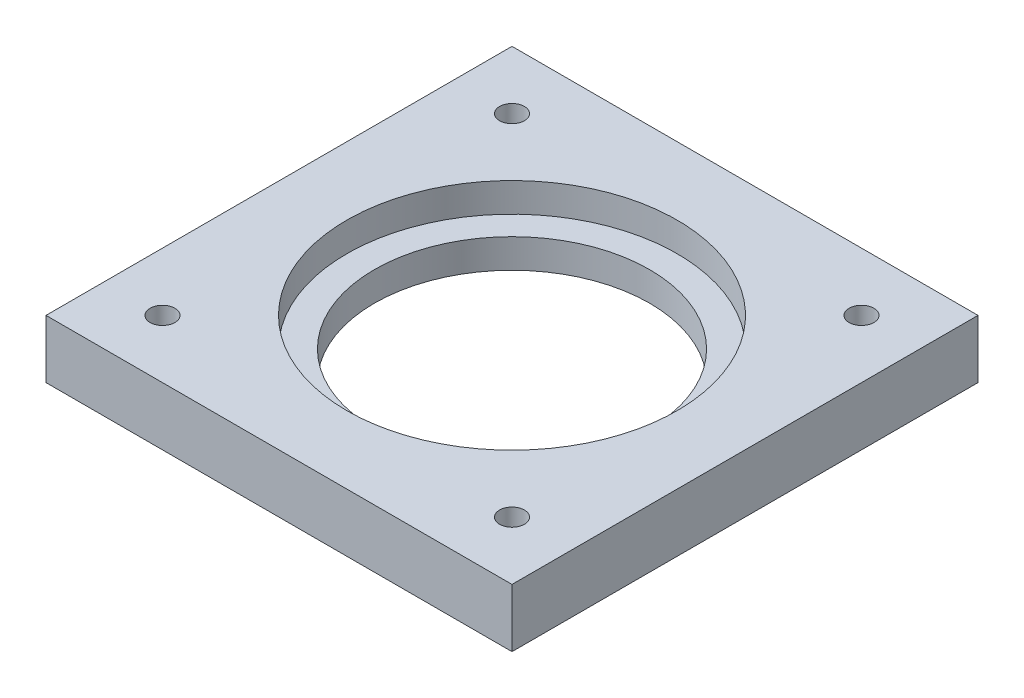
ISO-10303-21;
HEADER;
FILE_DESCRIPTION(('STEP AP214'),'2;1');
FILE_NAME('part.step','',(''),(''),'','','');
FILE_SCHEMA(('AUTOMOTIVE_DESIGN { 1 0 10303 214 1 1 1 1 }'));
ENDSEC;
DATA;
#1=APPLICATION_CONTEXT('core data for automotive mechanical design processes');
#2=APPLICATION_PROTOCOL_DEFINITION('international standard','automotive_design',2000,#1);
#3=PRODUCT_CONTEXT('',#1,'mechanical');
#4=PRODUCT('Part','Part','',(#3));
#5=PRODUCT_RELATED_PRODUCT_CATEGORY('part','',(#4));
#6=PRODUCT_DEFINITION_FORMATION('','',#4);
#7=PRODUCT_DEFINITION_CONTEXT('part definition',#1,'design');
#8=PRODUCT_DEFINITION('design','',#6,#7);
#9=PRODUCT_DEFINITION_SHAPE('','',#8);
#10=(LENGTH_UNIT() NAMED_UNIT(*) SI_UNIT(.MILLI.,.METRE.));
#11=(NAMED_UNIT(*) PLANE_ANGLE_UNIT() SI_UNIT($,.RADIAN.));
#12=(NAMED_UNIT(*) SI_UNIT($,.STERADIAN.) SOLID_ANGLE_UNIT());
#13=UNCERTAINTY_MEASURE_WITH_UNIT(LENGTH_MEASURE(1.E-05),#10,'distance_accuracy_value','');
#14=(GEOMETRIC_REPRESENTATION_CONTEXT(3) GLOBAL_UNCERTAINTY_ASSIGNED_CONTEXT((#13)) GLOBAL_UNIT_ASSIGNED_CONTEXT((#10,
#11,#12)) REPRESENTATION_CONTEXT('',''));
#15=CARTESIAN_POINT('',(0.,0.,0.));
#16=DIRECTION('',(0.,0.,1.));
#17=DIRECTION('',(1.,0.,0.));
#18=AXIS2_PLACEMENT_3D('',#15,#16,#17);
#19=CARTESIAN_POINT('',(0.,6.35,0.));
#20=DIRECTION('',(-1.,0.,0.));
#21=DIRECTION('',(0.,0.,1.));
#22=AXIS2_PLACEMENT_3D('',#19,#20,#21);
#23=PLANE('',#22);
#24=DIRECTION('',(0.,0.,-1.));
#25=VECTOR('',#24,1.);
#26=CARTESIAN_POINT('',(0.,0.,0.));
#27=LINE('',#26,#25);
#28=CARTESIAN_POINT('',(0.,0.,0.));
#29=VERTEX_POINT('',#28);
#30=CARTESIAN_POINT('',(0.,0.,-50.8));
#31=VERTEX_POINT('',#30);
#32=EDGE_CURVE('E130',#29,#31,#27,.T.);
#33=ORIENTED_EDGE('',*,*,#32,.T.);
#34=DIRECTION('',(0.,-1.,0.));
#35=VECTOR('',#34,1.);
#36=CARTESIAN_POINT('',(0.,6.35,-50.8));
#37=LINE('',#36,#35);
#38=CARTESIAN_POINT('',(0.,6.35,-50.8));
#39=VERTEX_POINT('',#38);
#40=EDGE_CURVE('E12',#39,#31,#37,.T.);
#41=ORIENTED_EDGE('',*,*,#40,.F.);
#42=DIRECTION('',(0.,0.,-1.));
#43=VECTOR('',#42,1.);
#44=CARTESIAN_POINT('',(0.,6.35,0.));
#45=LINE('',#44,#43);
#46=CARTESIAN_POINT('',(0.,6.35,0.));
#47=VERTEX_POINT('',#46);
#48=EDGE_CURVE('E93',#47,#39,#45,.T.);
#49=ORIENTED_EDGE('',*,*,#48,.F.);
#50=DIRECTION('',(0.,-1.,0.));
#51=VECTOR('',#50,1.);
#52=CARTESIAN_POINT('',(0.,6.35,0.));
#53=LINE('',#52,#51);
#54=EDGE_CURVE('E105',#47,#29,#53,.T.);
#55=ORIENTED_EDGE('',*,*,#54,.T.);
#56=EDGE_LOOP('',(#33,#41,#49,#55));
#57=FACE_BOUND('',#56,.T.);
#58=ADVANCED_FACE('F40',(#57),#23,.F.);
#59=CARTESIAN_POINT('',(0.,6.35,-50.8));
#60=DIRECTION('',(0.,0.,1.));
#61=DIRECTION('',(1.,0.,0.));
#62=AXIS2_PLACEMENT_3D('',#59,#60,#61);
#63=PLANE('',#62);
#64=DIRECTION('',(-1.,0.,0.));
#65=VECTOR('',#64,1.);
#66=CARTESIAN_POINT('',(0.,0.,-50.8));
#67=LINE('',#66,#65);
#68=CARTESIAN_POINT('',(-50.8,0.,-50.8));
#69=VERTEX_POINT('',#68);
#70=EDGE_CURVE('E98',#31,#69,#67,.T.);
#71=ORIENTED_EDGE('',*,*,#70,.T.);
#72=DIRECTION('',(0.,-1.,0.));
#73=VECTOR('',#72,1.);
#74=CARTESIAN_POINT('',(-50.8,6.35,-50.8));
#75=LINE('',#74,#73);
#76=CARTESIAN_POINT('',(-50.8,6.35,-50.8));
#77=VERTEX_POINT('',#76);
#78=EDGE_CURVE('E50',#77,#69,#75,.T.);
#79=ORIENTED_EDGE('',*,*,#78,.F.);
#80=DIRECTION('',(-1.,0.,0.));
#81=VECTOR('',#80,1.);
#82=CARTESIAN_POINT('',(0.,6.35,-50.8));
#83=LINE('',#82,#81);
#84=EDGE_CURVE('E88',#39,#77,#83,.T.);
#85=ORIENTED_EDGE('',*,*,#84,.F.);
#86=ORIENTED_EDGE('',*,*,#40,.T.);
#87=EDGE_LOOP('',(#71,#79,#85,#86));
#88=FACE_BOUND('',#87,.T.);
#89=ADVANCED_FACE('F97',(#88),#63,.F.);
#90=CARTESIAN_POINT('',(-50.8,6.35,0.));
#91=DIRECTION('',(1.,0.,0.));
#92=DIRECTION('',(0.,0.,-1.));
#93=AXIS2_PLACEMENT_3D('',#90,#91,#92);
#94=PLANE('',#93);
#95=DIRECTION('',(0.,0.,1.));
#96=VECTOR('',#95,1.);
#97=CARTESIAN_POINT('',(-50.8,0.,0.));
#98=LINE('',#97,#96);
#99=CARTESIAN_POINT('',(-50.8,0.,0.));
#100=VERTEX_POINT('',#99);
#101=EDGE_CURVE('E75',#69,#100,#98,.T.);
#102=ORIENTED_EDGE('',*,*,#101,.T.);
#103=DIRECTION('',(0.,-1.,0.));
#104=VECTOR('',#103,1.);
#105=CARTESIAN_POINT('',(-50.8,6.35,0.));
#106=LINE('',#105,#104);
#107=CARTESIAN_POINT('',(-50.8,6.35,0.));
#108=VERTEX_POINT('',#107);
#109=EDGE_CURVE('E99',#108,#100,#106,.T.);
#110=ORIENTED_EDGE('',*,*,#109,.F.);
#111=DIRECTION('',(0.,0.,1.));
#112=VECTOR('',#111,1.);
#113=CARTESIAN_POINT('',(-50.8,6.35,0.));
#114=LINE('',#113,#112);
#115=EDGE_CURVE('E91',#77,#108,#114,.T.);
#116=ORIENTED_EDGE('',*,*,#115,.F.);
#117=ORIENTED_EDGE('',*,*,#78,.T.);
#118=EDGE_LOOP('',(#102,#110,#116,#117));
#119=FACE_BOUND('',#118,.T.);
#120=ADVANCED_FACE('F101',(#119),#94,.F.);
#121=CARTESIAN_POINT('',(0.,6.35,0.));
#122=DIRECTION('',(0.,0.,-1.));
#123=DIRECTION('',(-1.,0.,0.));
#124=AXIS2_PLACEMENT_3D('',#121,#122,#123);
#125=PLANE('',#124);
#126=DIRECTION('',(1.,0.,0.));
#127=VECTOR('',#126,1.);
#128=CARTESIAN_POINT('',(0.,0.,0.));
#129=LINE('',#128,#127);
#130=EDGE_CURVE('E81',#100,#29,#129,.T.);
#131=ORIENTED_EDGE('',*,*,#130,.T.);
#132=ORIENTED_EDGE('',*,*,#54,.F.);
#133=DIRECTION('',(1.,0.,0.));
#134=VECTOR('',#133,1.);
#135=CARTESIAN_POINT('',(0.,6.35,0.));
#136=LINE('',#135,#134);
#137=EDGE_CURVE('E58',#108,#47,#136,.T.);
#138=ORIENTED_EDGE('',*,*,#137,.F.);
#139=ORIENTED_EDGE('',*,*,#109,.T.);
#140=EDGE_LOOP('',(#131,#132,#138,#139));
#141=FACE_BOUND('',#140,.T.);
#142=ADVANCED_FACE('F193',(#141),#125,.F.);
#143=CARTESIAN_POINT('',(0.,6.35,0.));
#144=DIRECTION('',(0.,1.,0.));
#145=DIRECTION('',(0.,0.,1.));
#146=AXIS2_PLACEMENT_3D('',#143,#144,#145);
#147=PLANE('',#146);
#148=CARTESIAN_POINT('',(-6.35,6.35,-6.34999999999999));
#149=DIRECTION('',(0.,-1.,0.));
#150=DIRECTION('',(0.,0.,-1.));
#151=AXIS2_PLACEMENT_3D('',#148,#149,#150);
#152=CIRCLE('',#151,1.35255);
#153=CARTESIAN_POINT('',(-6.35,6.35,-7.70254999999999));
#154=VERTEX_POINT('',#153);
#155=EDGE_CURVE('E160',#154,#154,#152,.T.);
#156=ORIENTED_EDGE('',*,*,#155,.T.);
#157=EDGE_LOOP('',(#156));
#158=FACE_BOUND('',#157,.T.);
#159=CARTESIAN_POINT('',(-6.35000000000008,6.35,-44.4500000000005));
#160=DIRECTION('',(0.,-1.,0.));
#161=DIRECTION('',(0.,0.,-1.));
#162=AXIS2_PLACEMENT_3D('',#159,#160,#161);
#163=CIRCLE('',#162,1.35255);
#164=CARTESIAN_POINT('',(-6.35000000000008,6.35,-45.8025500000005));
#165=VERTEX_POINT('',#164);
#166=EDGE_CURVE('E152',#165,#165,#163,.T.);
#167=ORIENTED_EDGE('',*,*,#166,.T.);
#168=EDGE_LOOP('',(#167));
#169=FACE_BOUND('',#168,.T.);
#170=CARTESIAN_POINT('',(-44.4500000000006,6.35,-44.4500000000003));
#171=DIRECTION('',(0.,-1.,0.));
#172=DIRECTION('',(0.,0.,-1.));
#173=AXIS2_PLACEMENT_3D('',#170,#171,#172);
#174=CIRCLE('',#173,1.35255);
#175=CARTESIAN_POINT('',(-44.4500000000006,6.35,-45.8025500000003));
#176=VERTEX_POINT('',#175);
#177=EDGE_CURVE('E145',#176,#176,#174,.T.);
#178=ORIENTED_EDGE('',*,*,#177,.T.);
#179=EDGE_LOOP('',(#178));
#180=FACE_BOUND('',#179,.T.);
#181=CARTESIAN_POINT('',(-44.4500000000002,6.35,-6.34999999999978));
#182=DIRECTION('',(0.,-1.,0.));
#183=DIRECTION('',(0.,0.,-1.));
#184=AXIS2_PLACEMENT_3D('',#181,#182,#183);
#185=CIRCLE('',#184,1.35255);
#186=CARTESIAN_POINT('',(-44.4500000000002,6.35,-7.70254999999978));
#187=VERTEX_POINT('',#186);
#188=EDGE_CURVE('E134',#187,#187,#185,.T.);
#189=ORIENTED_EDGE('',*,*,#188,.T.);
#190=EDGE_LOOP('',(#189));
#191=FACE_BOUND('',#190,.T.);
#192=CARTESIAN_POINT('',(-25.4,6.35,-25.4));
#193=DIRECTION('',(0.,1.,0.));
#194=DIRECTION('',(0.,0.,1.));
#195=AXIS2_PLACEMENT_3D('',#192,#193,#194);
#196=CIRCLE('',#195,18.);
#197=CARTESIAN_POINT('',(-25.4,6.35,-7.4));
#198=VERTEX_POINT('',#197);
#199=EDGE_CURVE('E121',#198,#198,#196,.T.);
#200=ORIENTED_EDGE('',*,*,#199,.F.);
#201=EDGE_LOOP('',(#200));
#202=FACE_BOUND('',#201,.T.);
#203=ORIENTED_EDGE('',*,*,#48,.T.);
#204=ORIENTED_EDGE('',*,*,#84,.T.);
#205=ORIENTED_EDGE('',*,*,#115,.T.);
#206=ORIENTED_EDGE('',*,*,#137,.T.);
#207=EDGE_LOOP('',(#203,#204,#205,#206));
#208=FACE_BOUND('',#207,.T.);
#209=ADVANCED_FACE('F89',(#158,#169,#180,#191,#202,#208),#147,.T.);
#210=CARTESIAN_POINT('',(0.,0.,0.));
#211=DIRECTION('',(0.,1.,0.));
#212=DIRECTION('',(0.,0.,1.));
#213=AXIS2_PLACEMENT_3D('',#210,#211,#212);
#214=PLANE('',#213);
#215=CARTESIAN_POINT('',(-6.35,0.,-6.34999999999999));
#216=DIRECTION('',(0.,-1.,0.));
#217=DIRECTION('',(0.,0.,-1.));
#218=AXIS2_PLACEMENT_3D('',#215,#216,#217);
#219=CIRCLE('',#218,1.35255);
#220=CARTESIAN_POINT('',(-6.35,0.,-7.70254999999999));
#221=VERTEX_POINT('',#220);
#222=EDGE_CURVE('E165',#221,#221,#219,.T.);
#223=ORIENTED_EDGE('',*,*,#222,.F.);
#224=EDGE_LOOP('',(#223));
#225=FACE_BOUND('',#224,.T.);
#226=CARTESIAN_POINT('',(-6.35000000000008,0.,-44.4500000000005));
#227=DIRECTION('',(0.,-1.,0.));
#228=DIRECTION('',(0.,0.,-1.));
#229=AXIS2_PLACEMENT_3D('',#226,#227,#228);
#230=CIRCLE('',#229,1.35255);
#231=CARTESIAN_POINT('',(-6.35000000000008,0.,-45.8025500000005));
#232=VERTEX_POINT('',#231);
#233=EDGE_CURVE('E157',#232,#232,#230,.T.);
#234=ORIENTED_EDGE('',*,*,#233,.F.);
#235=EDGE_LOOP('',(#234));
#236=FACE_BOUND('',#235,.T.);
#237=CARTESIAN_POINT('',(-44.4500000000006,0.,-44.4500000000003));
#238=DIRECTION('',(0.,-1.,0.));
#239=DIRECTION('',(0.,0.,-1.));
#240=AXIS2_PLACEMENT_3D('',#237,#238,#239);
#241=CIRCLE('',#240,1.35255);
#242=CARTESIAN_POINT('',(-44.4500000000006,0.,-45.8025500000003));
#243=VERTEX_POINT('',#242);
#244=EDGE_CURVE('E150',#243,#243,#241,.T.);
#245=ORIENTED_EDGE('',*,*,#244,.F.);
#246=EDGE_LOOP('',(#245));
#247=FACE_BOUND('',#246,.T.);
#248=CARTESIAN_POINT('',(-44.4500000000002,0.,-6.34999999999978));
#249=DIRECTION('',(0.,-1.,0.));
#250=DIRECTION('',(0.,0.,-1.));
#251=AXIS2_PLACEMENT_3D('',#248,#249,#250);
#252=CIRCLE('',#251,1.35255);
#253=CARTESIAN_POINT('',(-44.4500000000002,0.,-7.70254999999978));
#254=VERTEX_POINT('',#253);
#255=EDGE_CURVE('E139',#254,#254,#252,.T.);
#256=ORIENTED_EDGE('',*,*,#255,.F.);
#257=EDGE_LOOP('',(#256));
#258=FACE_BOUND('',#257,.T.);
#259=CARTESIAN_POINT('',(-25.4000000000002,0.,-25.4000000000002));
#260=DIRECTION('',(0.,-1.,0.));
#261=DIRECTION('',(0.,0.,-1.));
#262=AXIS2_PLACEMENT_3D('',#259,#260,#261);
#263=CIRCLE('',#262,15.);
#264=CARTESIAN_POINT('',(-25.4000000000002,0.,-40.4000000000002));
#265=VERTEX_POINT('',#264);
#266=EDGE_CURVE('E131',#265,#265,#263,.T.);
#267=ORIENTED_EDGE('',*,*,#266,.F.);
#268=EDGE_LOOP('',(#267));
#269=FACE_BOUND('',#268,.T.);
#270=ORIENTED_EDGE('',*,*,#32,.F.);
#271=ORIENTED_EDGE('',*,*,#130,.F.);
#272=ORIENTED_EDGE('',*,*,#101,.F.);
#273=ORIENTED_EDGE('',*,*,#70,.F.);
#274=EDGE_LOOP('',(#270,#271,#272,#273));
#275=FACE_BOUND('',#274,.T.);
#276=ADVANCED_FACE('F171',(#225,#236,#247,#258,#269,#275),#214,.F.);
#277=CARTESIAN_POINT('',(-25.4,3.175,-25.4));
#278=DIRECTION('',(0.,1.,0.));
#279=DIRECTION('',(0.,0.,1.));
#280=AXIS2_PLACEMENT_3D('',#277,#278,#279);
#281=CYLINDRICAL_SURFACE('',#280,18.);
#282=CARTESIAN_POINT('',(-25.4,3.175,-25.4));
#283=DIRECTION('',(0.,1.,0.));
#284=DIRECTION('',(0.,0.,1.));
#285=AXIS2_PLACEMENT_3D('',#282,#283,#284);
#286=CIRCLE('',#285,18.);
#287=CARTESIAN_POINT('',(-25.4,3.175,-7.4));
#288=VERTEX_POINT('',#287);
#289=EDGE_CURVE('E125',#288,#288,#286,.T.);
#290=ORIENTED_EDGE('',*,*,#289,.F.);
#291=EDGE_LOOP('',(#290));
#292=FACE_BOUND('',#291,.T.);
#293=ORIENTED_EDGE('',*,*,#199,.T.);
#294=EDGE_LOOP('',(#293));
#295=FACE_BOUND('',#294,.T.);
#296=ADVANCED_FACE('F174',(#292,#295),#281,.F.);
#297=CARTESIAN_POINT('',(-25.4,3.175,-25.4));
#298=DIRECTION('',(0.,1.,0.));
#299=DIRECTION('',(0.,0.,1.));
#300=AXIS2_PLACEMENT_3D('',#297,#298,#299);
#301=PLANE('',#300);
#302=CARTESIAN_POINT('',(-25.4000000000002,3.175,-25.4000000000002));
#303=DIRECTION('',(0.,1.,0.));
#304=DIRECTION('',(0.,0.,1.));
#305=AXIS2_PLACEMENT_3D('',#302,#303,#304);
#306=CIRCLE('',#305,15.);
#307=CARTESIAN_POINT('',(-25.4000000000002,3.175,-10.4000000000002));
#308=VERTEX_POINT('',#307);
#309=EDGE_CURVE('E43',#308,#308,#306,.T.);
#310=ORIENTED_EDGE('',*,*,#309,.F.);
#311=EDGE_LOOP('',(#310));
#312=FACE_BOUND('',#311,.T.);
#313=ORIENTED_EDGE('',*,*,#289,.T.);
#314=EDGE_LOOP('',(#313));
#315=FACE_BOUND('',#314,.T.);
#316=ADVANCED_FACE('F210',(#312,#315),#301,.T.);
#317=CARTESIAN_POINT('',(-25.4000000000002,6.35,-25.4000000000002));
#318=DIRECTION('',(0.,-1.,0.));
#319=DIRECTION('',(0.,0.,-1.));
#320=AXIS2_PLACEMENT_3D('',#317,#318,#319);
#321=CYLINDRICAL_SURFACE('',#320,15.);
#322=ORIENTED_EDGE('',*,*,#309,.T.);
#323=EDGE_LOOP('',(#322));
#324=FACE_BOUND('',#323,.T.);
#325=ORIENTED_EDGE('',*,*,#266,.T.);
#326=EDGE_LOOP('',(#325));
#327=FACE_BOUND('',#326,.T.);
#328=ADVANCED_FACE('F214',(#324,#327),#321,.F.);
#329=CARTESIAN_POINT('',(-44.4500000000002,0.,-6.34999999999978));
#330=DIRECTION('',(0.,-1.,0.));
#331=DIRECTION('',(0.,0.,-1.));
#332=AXIS2_PLACEMENT_3D('',#329,#330,#331);
#333=CYLINDRICAL_SURFACE('',#332,1.35255);
#334=ORIENTED_EDGE('',*,*,#188,.F.);
#335=EDGE_LOOP('',(#334));
#336=FACE_BOUND('',#335,.T.);
#337=ORIENTED_EDGE('',*,*,#255,.T.);
#338=EDGE_LOOP('',(#337));
#339=FACE_BOUND('',#338,.T.);
#340=ADVANCED_FACE('F218',(#336,#339),#333,.F.);
#341=CARTESIAN_POINT('',(-44.4500000000006,0.,-44.4500000000003));
#342=DIRECTION('',(0.,-1.,0.));
#343=DIRECTION('',(0.,0.,-1.));
#344=AXIS2_PLACEMENT_3D('',#341,#342,#343);
#345=CYLINDRICAL_SURFACE('',#344,1.35255);
#346=ORIENTED_EDGE('',*,*,#177,.F.);
#347=EDGE_LOOP('',(#346));
#348=FACE_BOUND('',#347,.T.);
#349=ORIENTED_EDGE('',*,*,#244,.T.);
#350=EDGE_LOOP('',(#349));
#351=FACE_BOUND('',#350,.T.);
#352=ADVANCED_FACE('F222',(#348,#351),#345,.F.);
#353=CARTESIAN_POINT('',(-6.35000000000008,0.,-44.4500000000005));
#354=DIRECTION('',(0.,-1.,0.));
#355=DIRECTION('',(0.,0.,-1.));
#356=AXIS2_PLACEMENT_3D('',#353,#354,#355);
#357=CYLINDRICAL_SURFACE('',#356,1.35255);
#358=ORIENTED_EDGE('',*,*,#166,.F.);
#359=EDGE_LOOP('',(#358));
#360=FACE_BOUND('',#359,.T.);
#361=ORIENTED_EDGE('',*,*,#233,.T.);
#362=EDGE_LOOP('',(#361));
#363=FACE_BOUND('',#362,.T.);
#364=ADVANCED_FACE('F226',(#360,#363),#357,.F.);
#365=CARTESIAN_POINT('',(-6.35,0.,-6.34999999999999));
#366=DIRECTION('',(0.,-1.,0.));
#367=DIRECTION('',(0.,0.,-1.));
#368=AXIS2_PLACEMENT_3D('',#365,#366,#367);
#369=CYLINDRICAL_SURFACE('',#368,1.35255);
#370=ORIENTED_EDGE('',*,*,#155,.F.);
#371=EDGE_LOOP('',(#370));
#372=FACE_BOUND('',#371,.T.);
#373=ORIENTED_EDGE('',*,*,#222,.T.);
#374=EDGE_LOOP('',(#373));
#375=FACE_BOUND('',#374,.T.);
#376=ADVANCED_FACE('F169',(#372,#375),#369,.F.);
#377=CLOSED_SHELL('',(#58,#89,#120,#142,#209,#276,#296,#316,#328,#340,#352,#364,#376));
#378=MANIFOLD_SOLID_BREP('B2',#377);
#379=ADVANCED_BREP_SHAPE_REPRESENTATION('',(#18,#378),#14);
#380=SHAPE_DEFINITION_REPRESENTATION(#9,#379);
ENDSEC;
END-ISO-10303-21;
